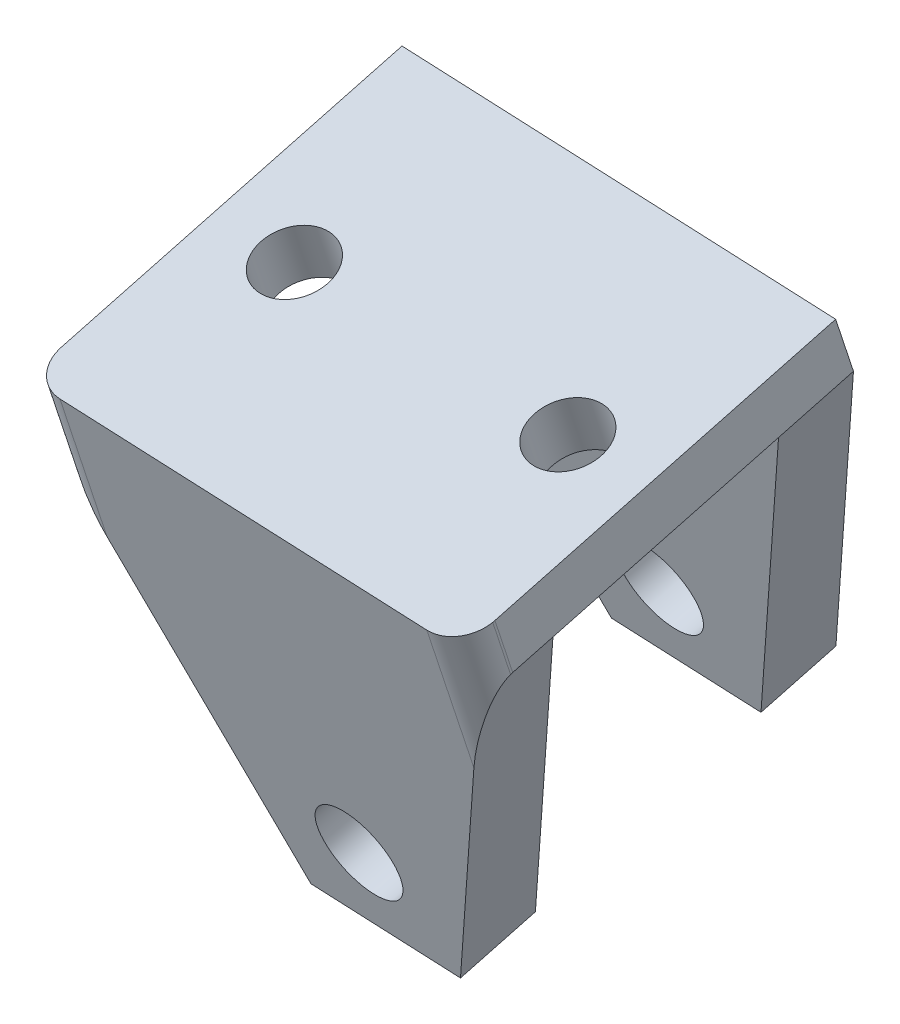
ISO-10303-21;
HEADER;
FILE_DESCRIPTION(('STEP AP214'),'2;1');
FILE_NAME('part.step','',(''),(''),'','','');
FILE_SCHEMA(('AUTOMOTIVE_DESIGN { 1 0 10303 214 1 1 1 1 }'));
ENDSEC;
DATA;
#1=APPLICATION_CONTEXT('core data for automotive mechanical design processes');
#2=APPLICATION_PROTOCOL_DEFINITION('international standard','automotive_design',2000,#1);
#3=PRODUCT_CONTEXT('',#1,'mechanical');
#4=PRODUCT('Part','Part','',(#3));
#5=PRODUCT_RELATED_PRODUCT_CATEGORY('part','',(#4));
#6=PRODUCT_DEFINITION_FORMATION('','',#4);
#7=PRODUCT_DEFINITION_CONTEXT('part definition',#1,'design');
#8=PRODUCT_DEFINITION('design','',#6,#7);
#9=PRODUCT_DEFINITION_SHAPE('','',#8);
#10=(LENGTH_UNIT() NAMED_UNIT(*) SI_UNIT(.MILLI.,.METRE.));
#11=(NAMED_UNIT(*) PLANE_ANGLE_UNIT() SI_UNIT($,.RADIAN.));
#12=(NAMED_UNIT(*) SI_UNIT($,.STERADIAN.) SOLID_ANGLE_UNIT());
#13=UNCERTAINTY_MEASURE_WITH_UNIT(LENGTH_MEASURE(1.E-05),#10,'distance_accuracy_value','');
#14=(GEOMETRIC_REPRESENTATION_CONTEXT(3) GLOBAL_UNCERTAINTY_ASSIGNED_CONTEXT((#13)) GLOBAL_UNIT_ASSIGNED_CONTEXT((#10,
#11,#12)) REPRESENTATION_CONTEXT('',''));
#15=CARTESIAN_POINT('',(0.,0.,0.));
#16=DIRECTION('',(0.,0.,1.));
#17=DIRECTION('',(1.,0.,0.));
#18=AXIS2_PLACEMENT_3D('',#15,#16,#17);
#19=CARTESIAN_POINT('',(-22.088554493688,-35.4296338674307,105.821123722836));
#20=DIRECTION('',(0.0133158588705676,-0.952264600171076,-0.304983309647527));
#21=DIRECTION('',(0.,0.305010351858926,-0.952349035416582));
#22=AXIS2_PLACEMENT_3D('',#19,#20,#21);
#23=PLANE('',#22);
#24=DIRECTION('',(-0.999048221581858,0.,-0.043619387365329));
#25=VECTOR('',#24,1.);
#26=CARTESIAN_POINT('',(-21.9355729917228,-34.3053102310021,102.317271268577));
#27=LINE('',#26,#25);
#28=CARTESIAN_POINT('',(16.1065418441597,-34.3053102311924,103.978225872484));
#29=VERTEX_POINT('',#28);
#30=CARTESIAN_POINT('',(-25.1075510952435,-34.3053102311924,102.178779713631));
#31=VERTEX_POINT('',#30);
#32=EDGE_CURVE('E170',#29,#31,#27,.T.);
#33=ORIENTED_EDGE('',*,*,#32,.T.);
#34=DIRECTION('',(-0.0415371984691523,-0.305273862721688,0.951358255276273));
#35=VECTOR('',#34,1.);
#36=CARTESIAN_POINT('',(-20.5914591715019,-1.11470333479966,-1.25673090294671));
#37=LINE('',#36,#35);
#38=CARTESIAN_POINT('',(-24.2497996394191,-28.0013439112412,82.5330414706006));
#39=VERTEX_POINT('',#38);
#40=EDGE_CURVE('E255',#39,#31,#37,.T.);
#41=ORIENTED_EDGE('',*,*,#40,.F.);
#42=DIRECTION('',(-0.999048221581858,0.,-0.0436193873653293));
#43=VECTOR('',#42,1.);
#44=CARTESIAN_POINT('',(-21.0778215358984,-28.001343911051,82.6715330255465));
#45=LINE('',#44,#43);
#46=CARTESIAN_POINT('',(16.9642932999841,-28.0013439112412,84.3324876294537));
#47=VERTEX_POINT('',#46);
#48=EDGE_CURVE('E180',#47,#39,#45,.T.);
#49=ORIENTED_EDGE('',*,*,#48,.F.);
#50=DIRECTION('',(-0.0415371984691524,-0.305273862721688,0.951358255276273));
#51=VECTOR('',#50,1.);
#52=CARTESIAN_POINT('',(20.6226337678996,-1.11470333479966,0.542715255906317));
#53=LINE('',#52,#51);
#54=EDGE_CURVE('E250',#47,#29,#53,.T.);
#55=ORIENTED_EDGE('',*,*,#54,.T.);
#56=EDGE_LOOP('',(#33,#41,#49,#55));
#57=FACE_BOUND('',#56,.T.);
#58=CARTESIAN_POINT('',(-17.0659279188797,-31.1533270711028,92.6882903239228));
#59=DIRECTION('',(0.0133158588705676,-0.952264600171076,-0.304983309647527));
#60=DIRECTION('',(0.,0.305010351858926,-0.952349035416582));
#61=AXIS2_PLACEMENT_3D('',#58,#59,#60);
#62=CIRCLE('',#61,3.175);
#63=CARTESIAN_POINT('',(-17.0659279188797,-32.1217349382549,95.7119985113705));
#64=VERTEX_POINT('',#63);
#65=EDGE_CURVE('E189',#64,#64,#62,.T.);
#66=ORIENTED_EDGE('',*,*,#65,.F.);
#67=EDGE_LOOP('',(#66));
#68=FACE_BOUND('',#67,.T.);
#69=CARTESIAN_POINT('',(8.92267012361577,-31.1533270712165,93.8229770192887));
#70=DIRECTION('',(0.0133158588705676,-0.952264600171076,-0.304983309647527));
#71=DIRECTION('',(0.,0.305010351858926,-0.952349035416582));
#72=AXIS2_PLACEMENT_3D('',#69,#70,#71);
#73=CIRCLE('',#72,3.175);
#74=CARTESIAN_POINT('',(8.92267012361577,-32.1217349383686,96.8466852067364));
#75=VERTEX_POINT('',#74);
#76=EDGE_CURVE('E168',#75,#75,#73,.T.);
#77=ORIENTED_EDGE('',*,*,#76,.F.);
#78=EDGE_LOOP('',(#77));
#79=FACE_BOUND('',#78,.T.);
#80=ADVANCED_FACE('F44',(#57,#68,#79),#23,.T.);
#81=CARTESIAN_POINT('',(-22.1561990567505,-30.5921296985616,107.370438935845));
#82=DIRECTION('',(0.0133158588705676,-0.952264600171076,-0.304983309647527));
#83=DIRECTION('',(0.,0.305010351858926,-0.952349035416582));
#84=AXIS2_PLACEMENT_3D('',#81,#82,#83);
#85=PLANE('',#84);
#86=CARTESIAN_POINT('',(-22.1561990567505,-30.5921296985616,107.370438935845));
#87=DIRECTION('',(0.0133158588705676,-0.952264600171076,-0.304983309647527));
#88=DIRECTION('',(0.,0.305010351858926,-0.952349035416582));
#89=AXIS2_PLACEMENT_3D('',#86,#87,#88);
#90=CIRCLE('',#89,3.175);
#91=CARTESIAN_POINT('',(-22.288079661886,-31.5613742128956,110.391001396294));
#92=VERTEX_POINT('',#91);
#93=CARTESIAN_POINT('',(-25.3302860569174,-30.6516996309224,107.417853475026));
#94=VERTEX_POINT('',#93);
#95=EDGE_CURVE('E193',#92,#94,#90,.T.);
#96=ORIENTED_EDGE('',*,*,#95,.F.);
#97=DIRECTION('',(0.999048221581858,0.,0.0436193873653294));
#98=VECTOR('',#97,1.);
#99=CARTESIAN_POINT('',(-4.8530112957095,-31.5613742128956,111.152232920835));
#100=LINE('',#99,#98);
#101=CARTESIAN_POINT('',(12.5820570704684,-31.561374212703,111.913464445418));
#102=VERTEX_POINT('',#101);
#103=EDGE_CURVE('E262',#92,#102,#100,.T.);
#104=ORIENTED_EDGE('',*,*,#103,.T.);
#105=CARTESIAN_POINT('',(12.713937675608,-30.5921296985616,108.892901984916));
#106=DIRECTION('',(0.0133158588705676,-0.952264600171076,-0.304983309647527));
#107=DIRECTION('',(0.,0.305010351858926,-0.952349035416582));
#108=AXIS2_PLACEMENT_3D('',#105,#106,#107);
#109=CIRCLE('',#108,3.175);
#110=CARTESIAN_POINT('',(15.8718138670775,-30.6516996309374,109.216776007565));
#111=VERTEX_POINT('',#110);
#112=EDGE_CURVE('E264',#111,#102,#109,.T.);
#113=ORIENTED_EDGE('',*,*,#112,.F.);
#114=DIRECTION('',(0.0722329192291287,0.305129551364994,-0.949567460617431));
#115=VECTOR('',#114,1.);
#116=CARTESIAN_POINT('',(23.955758751473,3.49686451625618,2.94596350866755));
#117=LINE('',#116,#115);
#118=CARTESIAN_POINT('',(15.8859157791305,-30.5921296987439,109.031393539727));
#119=VERTEX_POINT('',#118);
#120=EDGE_CURVE('E281',#111,#119,#117,.T.);
#121=ORIENTED_EDGE('',*,*,#120,.T.);
#122=DIRECTION('',(-0.0415371984691524,-0.305273862721688,0.951358255276273));
#123=VECTOR('',#122,1.);
#124=CARTESIAN_POINT('',(20.5549892048371,3.72280083406941,2.09203046891575));
#125=LINE('',#124,#123);
#126=CARTESIAN_POINT('',(17.181510844021,-21.0702715918227,79.3573879277653));
#127=VERTEX_POINT('',#126);
#128=EDGE_CURVE('E278',#127,#119,#125,.T.);
#129=ORIENTED_EDGE('',*,*,#128,.F.);
#130=DIRECTION('',(-0.999048221581858,0.,-0.043619387365329));
#131=VECTOR('',#130,1.);
#132=CARTESIAN_POINT('',(-3.42553562567795,-21.0702715918227,78.4576648483389));
#133=LINE('',#132,#131);
#134=CARTESIAN_POINT('',(-24.0325820953805,-21.0702715918227,77.5579417689123));
#135=VERTEX_POINT('',#134);
#136=EDGE_CURVE('E275',#127,#135,#133,.T.);
#137=ORIENTED_EDGE('',*,*,#136,.T.);
#138=DIRECTION('',(-0.0415371984691523,-0.305273862721688,0.951358255276273));
#139=VECTOR('',#138,1.);
#140=CARTESIAN_POINT('',(-20.6591037345644,3.72280083406941,0.292584310062723));
#141=LINE('',#140,#139);
#142=CARTESIAN_POINT('',(-25.3281771602701,-30.5921296987631,107.231947380934));
#143=VERTEX_POINT('',#142);
#144=EDGE_CURVE('E272',#135,#143,#141,.T.);
#145=ORIENTED_EDGE('',*,*,#144,.T.);
#146=DIRECTION('',(-0.0108022061553594,-0.305129551364994,0.952249583473773));
#147=VECTOR('',#146,1.);
#148=CARTESIAN_POINT('',(-24.1213574946816,3.49686451625623,0.846871281038443));
#149=LINE('',#148,#147);
#150=EDGE_CURVE('E269',#143,#94,#149,.T.);
#151=ORIENTED_EDGE('',*,*,#150,.T.);
#152=EDGE_LOOP('',(#96,#104,#113,#121,#129,#137,#145,#151));
#153=FACE_BOUND('',#152,.T.);
#154=CARTESIAN_POINT('',(-17.1335724819421,-26.3158229022338,94.2376055369323));
#155=DIRECTION('',(0.0133158588705676,-0.952264600171076,-0.304983309647527));
#156=DIRECTION('',(0.,0.305010351858926,-0.952349035416582));
#157=AXIS2_PLACEMENT_3D('',#154,#155,#156);
#158=CIRCLE('',#157,3.175);
#159=CARTESIAN_POINT('',(-17.1335724819421,-27.2842307693859,97.2613137243799));
#160=VERTEX_POINT('',#159);
#161=EDGE_CURVE('E187',#160,#160,#158,.T.);
#162=ORIENTED_EDGE('',*,*,#161,.T.);
#163=EDGE_LOOP('',(#162));
#164=FACE_BOUND('',#163,.T.);
#165=CARTESIAN_POINT('',(8.85502556055329,-26.3158229023475,95.3722922322982));
#166=DIRECTION('',(0.0133158588705676,-0.952264600171076,-0.304983309647527));
#167=DIRECTION('',(0.,0.305010351858926,-0.952349035416582));
#168=AXIS2_PLACEMENT_3D('',#165,#166,#167);
#169=CIRCLE('',#168,3.175);
#170=CARTESIAN_POINT('',(8.85502556055329,-27.2842307694996,98.3960004197458));
#171=VERTEX_POINT('',#170);
#172=EDGE_CURVE('E164',#171,#171,#169,.T.);
#173=ORIENTED_EDGE('',*,*,#172,.T.);
#174=EDGE_LOOP('',(#173));
#175=FACE_BOUND('',#174,.T.);
#176=ADVANCED_FACE('F314',(#153,#164,#175),#85,.F.);
#177=CARTESIAN_POINT('',(-22.088554493688,-35.4296338674307,105.821123722836));
#178=DIRECTION('',(-0.0133158588705677,0.952264600171076,0.304983309647527));
#179=DIRECTION('',(0.,-0.305010351858926,0.952349035416582));
#180=AXIS2_PLACEMENT_3D('',#177,#178,#179);
#181=CYLINDRICAL_SURFACE('',#180,3.175);
#182=DIRECTION('',(-0.0133158588705677,0.952264600171076,0.304983309647527));
#183=VECTOR('',#182,1.);
#184=CARTESIAN_POINT('',(-25.2626414938549,-35.4892037997915,105.868538262017));
#185=LINE('',#184,#183);
#186=CARTESIAN_POINT('',(-25.2624311948768,-35.5042430303971,105.863721623528));
#187=VERTEX_POINT('',#186);
#188=EDGE_CURVE('E299',#187,#94,#185,.T.);
#189=ORIENTED_EDGE('',*,*,#188,.F.);
#190=CARTESIAN_POINT('',(-21.9773124530868,-43.3849492808049,103.273262105776));
#191=DIRECTION('',(0.92914688746844,0.338302388046602,0.149122619845803));
#192=DIRECTION('',(-0.367370007827318,0.89014569761413,0.269592125938445));
#193=AXIS2_PLACEMENT_3D('',#190,#191,#192);
#194=ELLIPSE('',#193,8.93709359546902,3.175);
#195=CARTESIAN_POINT('',(-22.1091930582248,-44.3541937949529,106.293824566284));
#196=VERTEX_POINT('',#195);
#197=EDGE_CURVE('E216',#187,#196,#194,.T.);
#198=ORIENTED_EDGE('',*,*,#197,.T.);
#199=DIRECTION('',(-0.0133158588705677,0.952264600171076,0.304983309647527));
#200=VECTOR('',#199,1.);
#201=CARTESIAN_POINT('',(-22.2204350988235,-36.3988783817647,108.841686183284));
#202=LINE('',#201,#200);
#203=EDGE_CURVE('E159',#196,#92,#202,.T.);
#204=ORIENTED_EDGE('',*,*,#203,.T.);
#205=ORIENTED_EDGE('',*,*,#95,.T.);
#206=EDGE_LOOP('',(#189,#198,#204,#205));
#207=FACE_BOUND('',#206,.T.);
#208=ADVANCED_FACE('F46',(#207),#181,.T.);
#209=CARTESIAN_POINT('',(-24.0537129316191,-1.34063965261283,-0.702443931970994));
#210=DIRECTION('',(-0.999852989316288,-0.00938552847833725,-0.0143496205687147));
#211=DIRECTION('',(-0.0143502526262,0.,0.999897029823353));
#212=AXIS2_PLACEMENT_3D('',#209,#210,#211);
#213=PLANE('',#212);
#214=DIRECTION('',(0.00969334574264822,0.380919255247329,-0.924557494172284));
#215=VECTOR('',#214,1.);
#216=CARTESIAN_POINT('',(-24.1811206621867,6.98799997205818,2.72763393323471));
#217=LINE('',#216,#215);
#218=CARTESIAN_POINT('',(-25.2605325972102,-35.4296338676321,105.682632167925));
#219=VERTEX_POINT('',#218);
#220=EDGE_CURVE('E218',#187,#219,#217,.T.);
#221=ORIENTED_EDGE('',*,*,#220,.F.);
#222=ORIENTED_EDGE('',*,*,#188,.T.);
#223=ORIENTED_EDGE('',*,*,#150,.F.);
#224=DIRECTION('',(-0.0133158588705677,0.952264600171076,0.304983309647527));
#225=VECTOR('',#224,1.);
#226=CARTESIAN_POINT('',(-25.2605325972076,-35.4296338676322,105.682632167925));
#227=LINE('',#226,#225);
#228=EDGE_CURVE('E297',#219,#143,#227,.T.);
#229=ORIENTED_EDGE('',*,*,#228,.F.);
#230=EDGE_LOOP('',(#221,#222,#223,#229));
#231=FACE_BOUND('',#230,.T.);
#232=ADVANCED_FACE('F331',(#231),#213,.T.);
#233=CARTESIAN_POINT('',(-20.5914591715019,-1.11470333479966,-1.25673090294671));
#234=DIRECTION('',(-0.999048221581858,0.,-0.043619387365329));
#235=DIRECTION('',(-0.043619387365329,0.,0.999048221581858));
#236=AXIS2_PLACEMENT_3D('',#233,#234,#235);
#237=PLANE('',#236);
#238=DIRECTION('',(-0.0415371984691522,-0.30527386272169,0.951358255276272));
#239=VECTOR('',#238,1.);
#240=CARTESIAN_POINT('',(-17.1039603910172,24.5163517963293,-81.1335853216006));
#241=LINE('',#240,#239);
#242=EDGE_CURVE('E151',#31,#219,#241,.T.);
#243=ORIENTED_EDGE('',*,*,#242,.T.);
#244=ORIENTED_EDGE('',*,*,#228,.T.);
#245=ORIENTED_EDGE('',*,*,#144,.F.);
#246=DIRECTION('',(-0.0133158588705677,0.952264600171076,0.304983309647527));
#247=VECTOR('',#246,1.);
#248=CARTESIAN_POINT('',(-23.964937532318,-25.9077757606918,76.0086265559029));
#249=LINE('',#248,#247);
#250=CARTESIAN_POINT('',(-23.9649375323171,-25.9077757606917,76.0086265559029));
#251=VERTEX_POINT('',#250);
#252=EDGE_CURVE('E295',#251,#135,#249,.T.);
#253=ORIENTED_EDGE('',*,*,#252,.F.);
#254=EDGE_CURVE('E225',#251,#39,#241,.T.);
#255=ORIENTED_EDGE('',*,*,#254,.T.);
#256=ORIENTED_EDGE('',*,*,#40,.T.);
#257=EDGE_LOOP('',(#243,#244,#245,#253,#255,#256));
#258=FACE_BOUND('',#257,.T.);
#259=ADVANCED_FACE('F333',(#258),#237,.T.);
#260=CARTESIAN_POINT('',(-3.35789106261546,-25.9077757606918,76.9083496353294));
#261=DIRECTION('',(0.0415371984691523,0.305273862721688,-0.951358255276273));
#262=DIRECTION('',(0.,0.952180026486865,0.305537554417576));
#263=AXIS2_PLACEMENT_3D('',#260,#261,#262);
#264=PLANE('',#263);
#265=CARTESIAN_POINT('',(-2.98584596577187,-52.5140486894716,68.3871159637776));
#266=DIRECTION('',(0.0415371984691523,0.305273862721688,-0.951358255276273));
#267=DIRECTION('',(0.,0.952180026486865,0.305537554417576));
#268=AXIS2_PLACEMENT_3D('',#265,#266,#267);
#269=CIRCLE('',#268,3.96875);
#270=CARTESIAN_POINT('',(-2.98584596577187,-48.7350842093519,69.5997181328723));
#271=VERTEX_POINT('',#270);
#272=EDGE_CURVE('E184',#271,#271,#269,.T.);
#273=ORIENTED_EDGE('',*,*,#272,.F.);
#274=EDGE_LOOP('',(#273));
#275=FACE_BOUND('',#274,.T.);
#276=DIRECTION('',(0.342475552060416,0.89014569761413,0.300584652402559));
#277=VECTOR('',#276,1.);
#278=CARTESIAN_POINT('',(14.7395450544246,-32.4306321942962,75.6054326986081));
#279=LINE('',#278,#277);
#280=CARTESIAN_POINT('',(4.22085183070946,-59.7703049425588,66.3733642272657));
#281=VERTEX_POINT('',#280);
#282=CARTESIAN_POINT('',(17.2491554070861,-25.9077757606917,77.8080727147561));
#283=VERTEX_POINT('',#282);
#284=EDGE_CURVE('E204',#281,#283,#279,.T.);
#285=ORIENTED_EDGE('',*,*,#284,.F.);
#286=DIRECTION('',(-0.999048221581858,0.,-0.043619387365329));
#287=VECTOR('',#286,1.);
#288=CARTESIAN_POINT('',(-20.3194474873586,-59.7703049425823,65.3019116197744));
#289=LINE('',#288,#287);
#290=CARTESIAN_POINT('',(-9.98961007306117,-59.7703049425823,65.7529220613742));
#291=VERTEX_POINT('',#290);
#292=EDGE_CURVE('E176',#281,#291,#289,.T.);
#293=ORIENTED_EDGE('',*,*,#292,.T.);
#294=DIRECTION('',(0.367370007827318,-0.89014569761413,-0.269592125938445));
#295=VECTOR('',#294,1.);
#296=CARTESIAN_POINT('',(-21.2729042781064,-32.4306321942962,74.033095204305));
#297=LINE('',#296,#295);
#298=EDGE_CURVE('E220',#251,#291,#297,.T.);
#299=ORIENTED_EDGE('',*,*,#298,.F.);
#300=ORIENTED_EDGE('',*,*,#252,.T.);
#301=ORIENTED_EDGE('',*,*,#136,.F.);
#302=DIRECTION('',(-0.0133158588705677,0.952264600171076,0.304983309647527));
#303=VECTOR('',#302,1.);
#304=CARTESIAN_POINT('',(17.2491554070835,-25.9077757606918,77.8080727147559));
#305=LINE('',#304,#303);
#306=EDGE_CURVE('E293',#283,#127,#305,.T.);
#307=ORIENTED_EDGE('',*,*,#306,.F.);
#308=EDGE_LOOP('',(#285,#293,#299,#300,#301,#307));
#309=FACE_BOUND('',#308,.T.);
#310=ADVANCED_FACE('F309',(#275,#309),#264,.T.);
#311=CARTESIAN_POINT('',(20.6226337678996,-1.11470333479966,0.542715255906317));
#312=DIRECTION('',(-0.999048221581858,0.,-0.0436193873653291));
#313=DIRECTION('',(-0.0436193873653291,0.,0.999048221581858));
#314=AXIS2_PLACEMENT_3D('',#311,#312,#313);
#315=PLANE('',#314);
#316=DIRECTION('',(-0.0133158588705677,0.952264600171076,0.304983309647527));
#317=VECTOR('',#316,1.);
#318=CARTESIAN_POINT('',(15.953560342193,-35.4296338676129,107.482078326718));
#319=LINE('',#318,#317);
#320=CARTESIAN_POINT('',(15.9535603421881,-35.4296338676679,107.48207832689));
#321=VERTEX_POINT('',#320);
#322=EDGE_CURVE('E291',#321,#119,#319,.T.);
#323=ORIENTED_EDGE('',*,*,#322,.F.);
#324=DIRECTION('',(-0.0415371984691522,-0.30527386272169,0.951358255276272));
#325=VECTOR('',#324,1.);
#326=CARTESIAN_POINT('',(24.110132548386,24.5163517963293,-79.3341391627475));
#327=LINE('',#326,#325);
#328=EDGE_CURVE('E234',#29,#321,#327,.T.);
#329=ORIENTED_EDGE('',*,*,#328,.F.);
#330=ORIENTED_EDGE('',*,*,#54,.F.);
#331=EDGE_CURVE('E232',#283,#47,#327,.T.);
#332=ORIENTED_EDGE('',*,*,#331,.F.);
#333=ORIENTED_EDGE('',*,*,#306,.T.);
#334=ORIENTED_EDGE('',*,*,#128,.T.);
#335=EDGE_LOOP('',(#323,#329,#330,#332,#333,#334));
#336=FACE_BOUND('',#335,.T.);
#337=ADVANCED_FACE('F252',(#336),#315,.F.);
#338=CARTESIAN_POINT('',(24.0234033145355,-1.34063965261289,1.39664829565811));
#339=DIRECTION('',(0.997298898666883,-0.0093855284783371,0.0728479139921318));
#340=DIRECTION('',(0.0728511227229204,0.,-0.997342826673963));
#341=AXIS2_PLACEMENT_3D('',#338,#339,#340);
#342=PLANE('',#341);
#343=DIRECTION('',(-0.07092403548189,-0.38091925524733,0.92188410452333));
#344=VECTOR('',#343,1.);
#345=CARTESIAN_POINT('',(23.8513752361983,6.98799997207333,4.82477799441357));
#346=LINE('',#345,#344);
#347=CARTESIAN_POINT('',(15.9396687291179,-35.5042430304002,107.662644156071));
#348=VERTEX_POINT('',#347);
#349=EDGE_CURVE('E206',#321,#348,#346,.T.);
#350=ORIENTED_EDGE('',*,*,#349,.F.);
#351=ORIENTED_EDGE('',*,*,#322,.T.);
#352=ORIENTED_EDGE('',*,*,#120,.F.);
#353=DIRECTION('',(-0.0133158588705677,0.952264600171076,0.304983309647527));
#354=VECTOR('',#353,1.);
#355=CARTESIAN_POINT('',(15.93945843014,-35.4892037998065,107.667460794556));
#356=LINE('',#355,#354);
#357=EDGE_CURVE('E289',#348,#111,#356,.T.);
#358=ORIENTED_EDGE('',*,*,#357,.F.);
#359=EDGE_LOOP('',(#350,#351,#352,#358));
#360=FACE_BOUND('',#359,.T.);
#361=ADVANCED_FACE('F320',(#360),#342,.T.);
#362=CARTESIAN_POINT('',(12.7815822386705,-35.4296338674307,107.343586771907));
#363=DIRECTION('',(-0.0133158588705677,0.952264600171076,0.304983309647527));
#364=DIRECTION('',(0.,-0.305010351858926,0.952349035416582));
#365=AXIS2_PLACEMENT_3D('',#362,#363,#364);
#366=CYLINDRICAL_SURFACE('',#365,3.175);
#367=DIRECTION('',(-0.0133158588705677,0.952264600171076,0.304983309647527));
#368=VECTOR('',#367,1.);
#369=CARTESIAN_POINT('',(12.6497016335309,-36.3988783815721,110.364149232409));
#370=LINE('',#369,#368);
#371=CARTESIAN_POINT('',(12.7609436741312,-44.3541937949449,107.81628761537));
#372=VERTEX_POINT('',#371);
#373=EDGE_CURVE('E287',#372,#102,#370,.T.);
#374=ORIENTED_EDGE('',*,*,#373,.F.);
#375=CARTESIAN_POINT('',(12.8928242792716,-43.3849492807975,104.795725154849));
#376=DIRECTION('',(-0.938608095737645,0.338302388046602,0.0675746761569663));
#377=DIRECTION('',(0.342475552060416,0.89014569761413,0.300584652402559));
#378=AXIS2_PLACEMENT_3D('',#375,#376,#377);
#379=ELLIPSE('',#378,8.93709359546904,3.175);
#380=EDGE_CURVE('E208',#372,#348,#379,.T.);
#381=ORIENTED_EDGE('',*,*,#380,.T.);
#382=ORIENTED_EDGE('',*,*,#357,.T.);
#383=ORIENTED_EDGE('',*,*,#112,.T.);
#384=EDGE_LOOP('',(#374,#381,#382,#383));
#385=FACE_BOUND('',#384,.T.);
#386=ADVANCED_FACE('F324',(#385),#366,.T.);
#387=CARTESIAN_POINT('',(-4.78536673264701,-36.3988783817647,109.602917707826));
#388=DIRECTION('',(-0.0415371984691527,-0.305273862721688,0.951358255276273));
#389=DIRECTION('',(0.,-0.952180026486865,-0.305537554417576));
#390=AXIS2_PLACEMENT_3D('',#387,#388,#389);
#391=PLANE('',#390);
#392=CARTESIAN_POINT('',(-4.41332163580337,-63.0051513105445,101.081684036274));
#393=DIRECTION('',(-0.0415371984691522,-0.30527386272169,0.951358255276272));
#394=DIRECTION('',(0.,-0.952180026486864,-0.305537554417578));
#395=AXIS2_PLACEMENT_3D('',#392,#393,#394);
#396=CIRCLE('',#395,3.96875);
#397=CARTESIAN_POINT('',(-4.41332163580337,-66.7841157906643,99.8690818671793));
#398=VERTEX_POINT('',#397);
#399=EDGE_CURVE('E160',#398,#398,#396,.T.);
#400=ORIENTED_EDGE('',*,*,#399,.F.);
#401=EDGE_LOOP('',(#400));
#402=FACE_BOUND('',#401,.T.);
#403=DIRECTION('',(-0.342475552060416,-0.89014569761413,-0.300584652402561));
#404=VECTOR('',#403,1.);
#405=CARTESIAN_POINT('',(2.7933761606776,-70.2614075636343,99.0679322997706));
#406=LINE('',#405,#404);
#407=CARTESIAN_POINT('',(2.79337616067745,-70.2614075636552,99.0679322997547));
#408=VERTEX_POINT('',#407);
#409=EDGE_CURVE('E60',#372,#408,#406,.T.);
#410=ORIENTED_EDGE('',*,*,#409,.F.);
#411=ORIENTED_EDGE('',*,*,#373,.T.);
#412=ORIENTED_EDGE('',*,*,#103,.F.);
#413=ORIENTED_EDGE('',*,*,#203,.F.);
#414=DIRECTION('',(-0.367370007827318,0.890145697614129,0.269592125938446));
#415=VECTOR('',#414,1.);
#416=CARTESIAN_POINT('',(-11.4170857431028,-70.2614075636343,98.4474901338862));
#417=LINE('',#416,#415);
#418=CARTESIAN_POINT('',(-11.4170857431028,-70.2614075636343,98.4474901338862));
#419=VERTEX_POINT('',#418);
#420=EDGE_CURVE('E145',#419,#196,#417,.T.);
#421=ORIENTED_EDGE('',*,*,#420,.F.);
#422=DIRECTION('',(0.999048221581858,0.,0.0436193873653294));
#423=VECTOR('',#422,1.);
#424=CARTESIAN_POINT('',(-21.7469231573901,-70.2614075636552,97.996479692271));
#425=LINE('',#424,#423);
#426=EDGE_CURVE('E157',#419,#408,#425,.T.);
#427=ORIENTED_EDGE('',*,*,#426,.T.);
#428=EDGE_LOOP('',(#410,#411,#412,#413,#421,#427));
#429=FACE_BOUND('',#428,.T.);
#430=ADVANCED_FACE('F156',(#402,#429),#391,.T.);
#431=CARTESIAN_POINT('',(-17.0659279188797,-31.1533270711028,92.6882903239228));
#432=DIRECTION('',(-0.0133158588705677,0.952264600171076,0.304983309647527));
#433=DIRECTION('',(0.,-0.305010351858926,0.952349035416582));
#434=AXIS2_PLACEMENT_3D('',#431,#432,#433);
#435=CYLINDRICAL_SURFACE('',#434,3.175);
#436=CARTESIAN_POINT('',(-17.0659279188797,-32.1217349382549,95.7119985113705));
#437=CARTESIAN_POINT('',(-17.0666325497449,-32.0713442698292,95.728137211506));
#438=CARTESIAN_POINT('',(-17.0673371806101,-32.0209536014035,95.7442759116415));
#439=CARTESIAN_POINT('',(-17.0687464423406,-31.9201722645521,95.7765533119126));
#440=CARTESIAN_POINT('',(-17.0694510732058,-31.8697815961263,95.7926920120481));
#441=CARTESIAN_POINT('',(-17.0708603349363,-31.7690002592749,95.8249694123191));
#442=CARTESIAN_POINT('',(-17.0715649658015,-31.7186095908492,95.8411081124546));
#443=CARTESIAN_POINT('',(-17.072974227532,-31.6178282539977,95.8733855127256));
#444=CARTESIAN_POINT('',(-17.0736788583972,-31.567437585572,95.8895242128611));
#445=CARTESIAN_POINT('',(-17.0750881201277,-31.4666562487206,95.9218016131322));
#446=CARTESIAN_POINT('',(-17.0757927509929,-31.4162655802949,95.9379403132677));
#447=CARTESIAN_POINT('',(-17.0772020127234,-31.3154842434434,95.9702177135387));
#448=CARTESIAN_POINT('',(-17.0779066435886,-31.2650935750177,95.9863564136742));
#449=CARTESIAN_POINT('',(-17.0793159053191,-31.1643122381663,96.0186338139453));
#450=CARTESIAN_POINT('',(-17.0800205361843,-31.1139215697405,96.0347725140808));
#451=CARTESIAN_POINT('',(-17.0814297979148,-31.0131402328891,96.0670499143518));
#452=CARTESIAN_POINT('',(-17.08213442878,-30.9627495644634,96.0831886144873));
#453=CARTESIAN_POINT('',(-17.0835436905105,-30.8619682276119,96.1154660147584));
#454=CARTESIAN_POINT('',(-17.0842483213757,-30.8115775591862,96.1316047148939));
#455=CARTESIAN_POINT('',(-17.0856575831062,-30.7107962223348,96.1638821151649));
#456=CARTESIAN_POINT('',(-17.0863622139714,-30.6604055539091,96.1800208153004));
#457=CARTESIAN_POINT('',(-17.0877714757019,-30.5596242170576,96.2122982155715));
#458=CARTESIAN_POINT('',(-17.0884761065672,-30.5092335486319,96.228436915707));
#459=CARTESIAN_POINT('',(-17.0898853682976,-30.4084522117805,96.260714315978));
#460=CARTESIAN_POINT('',(-17.0905899991629,-30.3580615433548,96.2768530161135));
#461=CARTESIAN_POINT('',(-17.0919992608933,-30.2572802065033,96.3091304163845));
#462=CARTESIAN_POINT('',(-17.0927038917586,-30.2068895380776,96.3252691165201));
#463=CARTESIAN_POINT('',(-17.094113153489,-30.1061082012262,96.3575465167911));
#464=CARTESIAN_POINT('',(-17.0948177843543,-30.0557175328004,96.3736852169266));
#465=CARTESIAN_POINT('',(-17.0962270460847,-29.954936195949,96.4059626171976));
#466=CARTESIAN_POINT('',(-17.09693167695,-29.9045455275233,96.4221013173331));
#467=CARTESIAN_POINT('',(-17.0983409386804,-29.8037641906718,96.4543787176042));
#468=CARTESIAN_POINT('',(-17.0990455695457,-29.7533735222461,96.4705174177397));
#469=CARTESIAN_POINT('',(-17.1004548312761,-29.6525921853947,96.5027948180107));
#470=CARTESIAN_POINT('',(-17.1011594621414,-29.602201516969,96.5189335181462));
#471=CARTESIAN_POINT('',(-17.1025687238718,-29.5014201801175,96.5512109184173));
#472=CARTESIAN_POINT('',(-17.1032733547371,-29.4510295116918,96.5673496185528));
#473=CARTESIAN_POINT('',(-17.1046826164675,-29.3502481748404,96.5996270188238));
#474=CARTESIAN_POINT('',(-17.1053872473328,-29.2998575064146,96.6157657189593));
#475=CARTESIAN_POINT('',(-17.1067965090632,-29.1990761695632,96.6480431192304));
#476=CARTESIAN_POINT('',(-17.1075011399285,-29.1486855011375,96.6641818193659));
#477=CARTESIAN_POINT('',(-17.1089104016589,-29.047904164286,96.6964592196369));
#478=CARTESIAN_POINT('',(-17.1096150325242,-28.9975134958603,96.7125979197724));
#479=CARTESIAN_POINT('',(-17.1110242942546,-28.8967321590089,96.7448753200435));
#480=CARTESIAN_POINT('',(-17.1117289251199,-28.8463414905832,96.761014020179));
#481=CARTESIAN_POINT('',(-17.1131381868503,-28.7455601537317,96.79329142045));
#482=CARTESIAN_POINT('',(-17.1138428177156,-28.695169485306,96.8094301205855));
#483=CARTESIAN_POINT('',(-17.115252079446,-28.5943881484546,96.8417075208565));
#484=CARTESIAN_POINT('',(-17.1159567103113,-28.5439974800289,96.8578462209921));
#485=CARTESIAN_POINT('',(-17.1173659720417,-28.4432161431774,96.8901236212631));
#486=CARTESIAN_POINT('',(-17.118070602907,-28.3928254747517,96.9062623213986));
#487=CARTESIAN_POINT('',(-17.1194798646375,-28.2920441379003,96.9385397216696));
#488=CARTESIAN_POINT('',(-17.1201844955027,-28.2416534694745,96.9546784218052));
#489=CARTESIAN_POINT('',(-17.1215937572332,-28.1408721326231,96.9869558220762));
#490=CARTESIAN_POINT('',(-17.1222983880984,-28.0904814641974,97.0030945222117));
#491=CARTESIAN_POINT('',(-17.1237076498289,-27.9897001273459,97.0353719224827));
#492=CARTESIAN_POINT('',(-17.1244122806941,-27.9393094589202,97.0515106226182));
#493=CARTESIAN_POINT('',(-17.1258215424246,-27.8385281220688,97.0837880228893));
#494=CARTESIAN_POINT('',(-17.1265261732898,-27.7881374536431,97.0999267230248));
#495=CARTESIAN_POINT('',(-17.1279354350203,-27.6873561167916,97.1322041232958));
#496=CARTESIAN_POINT('',(-17.1286400658855,-27.6369654483659,97.1483428234313));
#497=CARTESIAN_POINT('',(-17.130049327616,-27.5361841115145,97.1806202237024));
#498=CARTESIAN_POINT('',(-17.1307539584812,-27.4857934430887,97.1967589238379));
#499=CARTESIAN_POINT('',(-17.1321632202117,-27.3850121062373,97.2290363241089));
#500=CARTESIAN_POINT('',(-17.1328678510769,-27.3346214378116,97.2451750242444));
#501=CARTESIAN_POINT('',(-17.1335724819421,-27.2842307693859,97.2613137243799));
#502=B_SPLINE_CURVE_WITH_KNOTS('',3,(#436,#437,#438,#439,#440,#441,#442,#443,#444,#445,#446,
#447,#448,#449,#450,#451,#452,#453,#454,#455,#456,#457,#458,#459,#460,#461,#462,#463,#464,#465,
#466,#467,#468,#469,#470,#471,#472,#473,#474,#475,#476,#477,#478,#479,#480,#481,#482,#483,#484,
#485,#486,#487,#488,#489,#490,#491,#492,#493,#494,#495,#496,#497,#498,#499,#500,#501),
.UNSPECIFIED.,.F.,.F.,(4,2,2,2,2,2,2,2,2,2,2,2,2,2,2,2,2,2,2,2,2,2,2,2,2,2,2,2,2,2,2,2,4),(0.,
0.158749999999992,0.317499999999995,0.476249999999994,0.634999999999993,0.793749999999996,
0.952499999999994,1.11124999999999,1.27,1.42874999999999,1.5875,1.74625,1.905,2.06375,
2.22249999999999,2.38124999999999,2.54,2.69874999999999,2.8575,3.01625,3.17499999999999,3.33375,
3.49249999999999,3.65124999999999,3.80999999999999,3.96874999999999,4.1275,4.28624999999999,
4.44499999999999,4.60375,4.7625,4.92124999999999,5.07999999999999),.UNSPECIFIED.);
#503=EDGE_CURVE('BSEAM349',#64,#160,#502,.T.);
#504=ORIENTED_EDGE('',*,*,#65,.T.);
#505=ORIENTED_EDGE('',*,*,#161,.F.);
#506=ORIENTED_EDGE('',*,*,#503,.T.);
#507=ORIENTED_EDGE('',*,*,#503,.F.);
#508=EDGE_LOOP('',(#504,#506,#505,#507));
#509=FACE_BOUND('',#508,.T.);
#510=ADVANCED_FACE('F349',(#509),#435,.F.);
#511=CARTESIAN_POINT('',(8.92267012361577,-31.1533270712165,93.8229770192887));
#512=DIRECTION('',(-0.0133158588705677,0.952264600171076,0.304983309647527));
#513=DIRECTION('',(0.,-0.305010351858926,0.952349035416582));
#514=AXIS2_PLACEMENT_3D('',#511,#512,#513);
#515=CYLINDRICAL_SURFACE('',#514,3.175);
#516=CARTESIAN_POINT('',(8.92267012361577,-32.1217349383686,96.8466852067364));
#517=CARTESIAN_POINT('',(8.92196549275054,-32.0713442699429,96.8628239068719));
#518=CARTESIAN_POINT('',(8.9212608618853,-32.0209536015172,96.8789626070074));
#519=CARTESIAN_POINT('',(8.91985160015484,-31.9201722646657,96.9112400072784));
#520=CARTESIAN_POINT('',(8.9191469692896,-31.86978159624,96.9273787074139));
#521=CARTESIAN_POINT('',(8.91773770755913,-31.7690002593886,96.959656107685));
#522=CARTESIAN_POINT('',(8.9170330766939,-31.7186095909629,96.9757948078205));
#523=CARTESIAN_POINT('',(8.91562381496343,-31.6178282541114,97.0080722080915));
#524=CARTESIAN_POINT('',(8.9149191840982,-31.5674375856857,97.024210908227));
#525=CARTESIAN_POINT('',(8.91350992236773,-31.4666562488343,97.0564883084981));
#526=CARTESIAN_POINT('',(8.91280529150249,-31.4162655804086,97.0726270086336));
#527=CARTESIAN_POINT('',(8.91139602977202,-31.3154842435571,97.1049044089046));
#528=CARTESIAN_POINT('',(8.91069139890679,-31.2650935751314,97.1210431090401));
#529=CARTESIAN_POINT('',(8.90928213717632,-31.16431223828,97.1533205093111));
#530=CARTESIAN_POINT('',(8.90857750631109,-31.1139215698542,97.1694592094467));
#531=CARTESIAN_POINT('',(8.90716824458062,-31.0131402330028,97.2017366097177));
#532=CARTESIAN_POINT('',(8.90646361371538,-30.9627495645771,97.2178753098532));
#533=CARTESIAN_POINT('',(8.90505435198492,-30.8619682277256,97.2501527101242));
#534=CARTESIAN_POINT('',(8.90434972111968,-30.8115775592999,97.2662914102598));
#535=CARTESIAN_POINT('',(8.90294045938921,-30.7107962224485,97.2985688105308));
#536=CARTESIAN_POINT('',(8.90223582852398,-30.6604055540228,97.3147075106663));
#537=CARTESIAN_POINT('',(8.90082656679351,-30.5596242171713,97.3469849109373));
#538=CARTESIAN_POINT('',(8.90012193592828,-30.5092335487456,97.3631236110728));
#539=CARTESIAN_POINT('',(8.89871267419781,-30.4084522118942,97.3954010113439));
#540=CARTESIAN_POINT('',(8.89800804333257,-30.3580615434684,97.4115397114794));
#541=CARTESIAN_POINT('',(8.89659878160211,-30.257280206617,97.4438171117504));
#542=CARTESIAN_POINT('',(8.89589415073687,-30.2068895381913,97.4599558118859));
#543=CARTESIAN_POINT('',(8.8944848890064,-30.1061082013398,97.492233212157));
#544=CARTESIAN_POINT('',(8.89378025814117,-30.0557175329141,97.5083719122925));
#545=CARTESIAN_POINT('',(8.8923709964107,-29.9549361960627,97.5406493125635));
#546=CARTESIAN_POINT('',(8.89166636554546,-29.904545527637,97.556788012699));
#547=CARTESIAN_POINT('',(8.890257103815,-29.8037641907855,97.58906541297));
#548=CARTESIAN_POINT('',(8.88955247294976,-29.7533735223598,97.6052041131056));
#549=CARTESIAN_POINT('',(8.8881432112193,-29.6525921855084,97.6374815133766));
#550=CARTESIAN_POINT('',(8.88743858035406,-29.6022015170826,97.6536202135121));
#551=CARTESIAN_POINT('',(8.88602931862359,-29.5014201802312,97.6858976137831));
#552=CARTESIAN_POINT('',(8.88532468775836,-29.4510295118055,97.7020363139187));
#553=CARTESIAN_POINT('',(8.88391542602789,-29.3502481749541,97.7343137141897));
#554=CARTESIAN_POINT('',(8.88321079516266,-29.2998575065283,97.7504524143252));
#555=CARTESIAN_POINT('',(8.88180153343219,-29.1990761696769,97.7827298145962));
#556=CARTESIAN_POINT('',(8.88109690256695,-29.1486855012512,97.7988685147317));
#557=CARTESIAN_POINT('',(8.87968764083648,-29.0479041643997,97.8311459150028));
#558=CARTESIAN_POINT('',(8.87898300997125,-28.997513495974,97.8472846151383));
#559=CARTESIAN_POINT('',(8.87757374824078,-28.8967321591226,97.8795620154093));
#560=CARTESIAN_POINT('',(8.87686911737555,-28.8463414906969,97.8957007155448));
#561=CARTESIAN_POINT('',(8.87545985564508,-28.7455601538454,97.9279781158159));
#562=CARTESIAN_POINT('',(8.87475522477984,-28.6951694854197,97.9441168159514));
#563=CARTESIAN_POINT('',(8.87334596304938,-28.5943881485683,97.9763942162224));
#564=CARTESIAN_POINT('',(8.87264133218414,-28.5439974801425,97.9925329163579));
#565=CARTESIAN_POINT('',(8.87123207045367,-28.4432161432911,98.024810316629));
#566=CARTESIAN_POINT('',(8.87052743958844,-28.3928254748654,98.0409490167645));
#567=CARTESIAN_POINT('',(8.86911817785797,-28.2920441380139,98.0732264170355));
#568=CARTESIAN_POINT('',(8.86841354699274,-28.2416534695882,98.089365117171));
#569=CARTESIAN_POINT('',(8.86700428526227,-28.1408721327368,98.1216425174421));
#570=CARTESIAN_POINT('',(8.86629965439703,-28.0904814643111,98.1377812175776));
#571=CARTESIAN_POINT('',(8.86489039266657,-27.9897001274596,98.1700586178486));
#572=CARTESIAN_POINT('',(8.86418576180133,-27.9393094590339,98.1861973179841));
#573=CARTESIAN_POINT('',(8.86277650007086,-27.8385281221825,98.2184747182551));
#574=CARTESIAN_POINT('',(8.86207186920563,-27.7881374537567,98.2346134183907));
#575=CARTESIAN_POINT('',(8.86066260747516,-27.6873561169053,98.2668908186617));
#576=CARTESIAN_POINT('',(8.85995797660993,-27.6369654484796,98.2830295187972));
#577=CARTESIAN_POINT('',(8.85854871487946,-27.5361841116282,98.3153069190682));
#578=CARTESIAN_POINT('',(8.85784408401422,-27.4857934432024,98.3314456192037));
#579=CARTESIAN_POINT('',(8.85643482228376,-27.385012106351,98.3637230194748));
#580=CARTESIAN_POINT('',(8.85573019141852,-27.3346214379253,98.3798617196103));
#581=CARTESIAN_POINT('',(8.85502556055329,-27.2842307694996,98.3960004197458));
#582=B_SPLINE_CURVE_WITH_KNOTS('',3,(#516,#517,#518,#519,#520,#521,#522,#523,#524,#525,#526,
#527,#528,#529,#530,#531,#532,#533,#534,#535,#536,#537,#538,#539,#540,#541,#542,#543,#544,#545,
#546,#547,#548,#549,#550,#551,#552,#553,#554,#555,#556,#557,#558,#559,#560,#561,#562,#563,#564,
#565,#566,#567,#568,#569,#570,#571,#572,#573,#574,#575,#576,#577,#578,#579,#580,#581),
.UNSPECIFIED.,.F.,.F.,(4,2,2,2,2,2,2,2,2,2,2,2,2,2,2,2,2,2,2,2,2,2,2,2,2,2,2,2,2,2,2,2,4),(0.,
0.158749999999992,0.317499999999995,0.476249999999994,0.634999999999993,0.793749999999996,
0.952499999999994,1.11124999999999,1.27,1.42874999999999,1.5875,1.74625,1.905,2.06375,
2.22249999999999,2.38124999999999,2.54,2.69874999999999,2.8575,3.01625,3.17499999999999,3.33375,
3.49249999999999,3.65124999999999,3.80999999999999,3.96874999999999,4.1275,4.28624999999999,
4.44499999999999,4.60375,4.7625,4.92124999999999,5.07999999999999),.UNSPECIFIED.);
#583=EDGE_CURVE('BSEAM339',#75,#171,#582,.T.);
#584=ORIENTED_EDGE('',*,*,#76,.T.);
#585=ORIENTED_EDGE('',*,*,#172,.F.);
#586=ORIENTED_EDGE('',*,*,#583,.T.);
#587=ORIENTED_EDGE('',*,*,#583,.F.);
#588=EDGE_LOOP('',(#584,#586,#585,#587));
#589=FACE_BOUND('',#588,.T.);
#590=ADVANCED_FACE('F339',(#589),#515,.F.);
#591=CARTESIAN_POINT('',(-21.4620610502854,-68.1678394130856,91.4720647775108));
#592=DIRECTION('',(0.0415371984691523,0.305273862721688,-0.951358255276273));
#593=DIRECTION('',(0.,0.952180026486865,0.305537554417576));
#594=AXIS2_PLACEMENT_3D('',#591,#592,#593);
#595=PLANE('',#594);
#596=CARTESIAN_POINT('',(-4.12845952869827,-60.9115831599723,94.5572691215057));
#597=DIRECTION('',(0.0415371984691523,0.305273862721688,-0.951358255276273));
#598=DIRECTION('',(0.,0.952180026486865,0.305537554417576));
#599=AXIS2_PLACEMENT_3D('',#596,#597,#598);
#600=CIRCLE('',#599,3.96875);
#601=CARTESIAN_POINT('',(-4.12845952869827,-57.1326186798526,95.7698712906004));
#602=VERTEX_POINT('',#601);
#603=EDGE_CURVE('E201',#602,#602,#600,.T.);
#604=ORIENTED_EDGE('',*,*,#603,.F.);
#605=EDGE_LOOP('',(#604));
#606=FACE_BOUND('',#605,.T.);
#607=DIRECTION('',(0.342475552060416,0.89014569761413,0.300584652402559));
#608=VECTOR('',#607,1.);
#609=CARTESIAN_POINT('',(0.0896203056332326,-75.9357089874438,89.9204609772903));
#610=LINE('',#609,#608);
#611=CARTESIAN_POINT('',(3.0782382677877,-68.1678394130254,92.5435173848878));
#612=VERTEX_POINT('',#611);
#613=EDGE_CURVE('E211',#612,#29,#610,.T.);
#614=ORIENTED_EDGE('',*,*,#613,.F.);
#615=DIRECTION('',(-0.999048221581858,0.,-0.043619387365329));
#616=VECTOR('',#615,1.);
#617=CARTESIAN_POINT('',(-21.4620610502854,-68.1678394130856,91.4720647775108));
#618=LINE('',#617,#616);
#619=CARTESIAN_POINT('',(-11.1322236359731,-68.1678394131039,91.9230752191054));
#620=VERTEX_POINT('',#619);
#621=EDGE_CURVE('E165',#612,#620,#618,.T.);
#622=ORIENTED_EDGE('',*,*,#621,.T.);
#623=DIRECTION('',(0.367370007827318,-0.89014569761413,-0.269592125938445));
#624=VECTOR('',#623,1.);
#625=CARTESIAN_POINT('',(-12.4816778564539,-64.8980818311339,92.9133635507673));
#626=LINE('',#625,#624);
#627=EDGE_CURVE('E68',#31,#620,#626,.T.);
#628=ORIENTED_EDGE('',*,*,#627,.F.);
#629=ORIENTED_EDGE('',*,*,#32,.F.);
#630=EDGE_LOOP('',(#614,#622,#628,#629));
#631=FACE_BOUND('',#630,.T.);
#632=ADVANCED_FACE('F337',(#606,#631),#595,.T.);
#633=CARTESIAN_POINT('',(-21.6150425522492,-69.2921630495492,94.9759172317532));
#634=DIRECTION('',(0.0133158588705676,-0.952264600171076,-0.304983309647527));
#635=DIRECTION('',(0.,0.305010351858926,-0.952349035416582));
#636=AXIS2_PLACEMENT_3D('',#633,#634,#635);
#637=PLANE('',#636);
#638=DIRECTION('',(-0.0415371984691522,-0.30527386272169,0.951358255276272));
#639=VECTOR('',#638,1.);
#640=CARTESIAN_POINT('',(11.081828972009,-9.3461773855404,-90.7688476502295));
#641=LINE('',#640,#639);
#642=EDGE_CURVE('E163',#612,#408,#641,.T.);
#643=ORIENTED_EDGE('',*,*,#642,.T.);
#644=ORIENTED_EDGE('',*,*,#426,.F.);
#645=DIRECTION('',(-0.0415371984691522,-0.30527386272169,0.951358255276272));
#646=VECTOR('',#645,1.);
#647=CARTESIAN_POINT('',(-3.12863293177139,-9.3461773855404,-91.3892898161139));
#648=LINE('',#647,#646);
#649=EDGE_CURVE('E142',#620,#419,#648,.T.);
#650=ORIENTED_EDGE('',*,*,#649,.F.);
#651=ORIENTED_EDGE('',*,*,#621,.F.);
#652=EDGE_LOOP('',(#643,#644,#650,#651));
#653=FACE_BOUND('',#652,.T.);
#654=ADVANCED_FACE('F162',(#653),#637,.T.);
#655=CARTESIAN_POINT('',(-20.604309594461,-61.8638730931345,71.8263265344804));
#656=DIRECTION('',(0.0415371984691526,0.305273862721688,-0.951358255276273));
#657=DIRECTION('',(0.,0.952180026486865,0.305537554417576));
#658=AXIS2_PLACEMENT_3D('',#655,#656,#657);
#659=PLANE('',#658);
#660=CARTESIAN_POINT('',(-3.27070807287389,-54.6076168400212,74.9115308784752));
#661=DIRECTION('',(0.0415371984691526,0.305273862721688,-0.951358255276273));
#662=DIRECTION('',(0.,0.952180026486865,0.305537554417576));
#663=AXIS2_PLACEMENT_3D('',#660,#661,#662);
#664=CIRCLE('',#663,3.96875);
#665=CARTESIAN_POINT('',(-3.27070807287389,-50.8286523599014,76.12413304757));
#666=VERTEX_POINT('',#665);
#667=EDGE_CURVE('E48',#666,#666,#664,.T.);
#668=ORIENTED_EDGE('',*,*,#667,.T.);
#669=EDGE_LOOP('',(#668));
#670=FACE_BOUND('',#669,.T.);
#671=DIRECTION('',(-0.999048221581858,0.,-0.0436193873653293));
#672=VECTOR('',#671,1.);
#673=CARTESIAN_POINT('',(-20.604309594461,-61.8638730931345,71.8263265344804));
#674=LINE('',#673,#672);
#675=CARTESIAN_POINT('',(3.93598972359803,-61.8638730931345,72.8977791419638));
#676=VERTEX_POINT('',#675);
#677=CARTESIAN_POINT('',(-10.2744721801733,-61.863873093111,72.2773369760874));
#678=VERTEX_POINT('',#677);
#679=EDGE_CURVE('E177',#676,#678,#674,.T.);
#680=ORIENTED_EDGE('',*,*,#679,.F.);
#681=DIRECTION('',(0.342475552060416,0.89014569761413,0.300584652402559));
#682=VECTOR('',#681,1.);
#683=CARTESIAN_POINT('',(0.947371761457604,-69.6317426674926,70.2747227342599));
#684=LINE('',#683,#682);
#685=EDGE_CURVE('E213',#676,#47,#684,.T.);
#686=ORIENTED_EDGE('',*,*,#685,.T.);
#687=ORIENTED_EDGE('',*,*,#48,.T.);
#688=DIRECTION('',(0.367370007827318,-0.89014569761413,-0.269592125938445));
#689=VECTOR('',#688,1.);
#690=CARTESIAN_POINT('',(-11.6239264006295,-58.5941155111828,73.2676253077369));
#691=LINE('',#690,#689);
#692=EDGE_CURVE('E223',#39,#678,#691,.T.);
#693=ORIENTED_EDGE('',*,*,#692,.T.);
#694=EDGE_LOOP('',(#680,#686,#687,#693));
#695=FACE_BOUND('',#694,.T.);
#696=ADVANCED_FACE('F247',(#670,#695),#659,.F.);
#697=CARTESIAN_POINT('',(0.489099239635328,-34.9772325166928,-11.2022143145252));
#698=DIRECTION('',(0.0133158588705676,-0.952264600171076,-0.304983309647527));
#699=DIRECTION('',(0.,0.305010351858926,-0.952349035416582));
#700=AXIS2_PLACEMENT_3D('',#697,#698,#699);
#701=PLANE('',#700);
#702=DIRECTION('',(0.0415371984691516,0.305273862721688,-0.951358255276273));
#703=VECTOR('',#702,1.);
#704=CARTESIAN_POINT('',(7.59433019151605,-34.9772325166928,-10.8919932315834));
#705=LINE('',#704,#703);
#706=EDGE_CURVE('E12',#676,#281,#705,.T.);
#707=ORIENTED_EDGE('',*,*,#706,.F.);
#708=ORIENTED_EDGE('',*,*,#679,.T.);
#709=DIRECTION('',(-0.0415371984691528,-0.305273862721688,0.951358255276273));
#710=VECTOR('',#709,1.);
#711=CARTESIAN_POINT('',(-6.61613171224543,-34.9772325166928,-11.512435397467));
#712=LINE('',#711,#710);
#713=EDGE_CURVE('E53',#291,#678,#712,.T.);
#714=ORIENTED_EDGE('',*,*,#713,.F.);
#715=ORIENTED_EDGE('',*,*,#292,.F.);
#716=EDGE_LOOP('',(#707,#708,#714,#715));
#717=FACE_BOUND('',#716,.T.);
#718=ADVANCED_FACE('F307',(#717),#701,.T.);
#719=CARTESIAN_POINT('',(-3.12863293177139,-9.3461773855404,-91.3892898161139));
#720=DIRECTION('',(0.92914688746844,0.338302388046602,0.149122619845803));
#721=DIRECTION('',(-0.342127817875605,0.93965342346829,0.));
#722=AXIS2_PLACEMENT_3D('',#719,#720,#721);
#723=PLANE('',#722);
#724=ORIENTED_EDGE('',*,*,#298,.T.);
#725=ORIENTED_EDGE('',*,*,#713,.T.);
#726=ORIENTED_EDGE('',*,*,#692,.F.);
#727=ORIENTED_EDGE('',*,*,#254,.F.);
#728=EDGE_LOOP('',(#724,#725,#726,#727));
#729=FACE_BOUND('',#728,.T.);
#730=ADVANCED_FACE('F303',(#729),#723,.F.);
#731=CARTESIAN_POINT('',(11.081828972009,-9.3461773855404,-90.7688476502295));
#732=DIRECTION('',(-0.938608095737645,0.338302388046602,0.0675746761569663));
#733=DIRECTION('',(-0.339077444768332,-0.94075846339503,0.));
#734=AXIS2_PLACEMENT_3D('',#731,#732,#733);
#735=PLANE('',#734);
#736=ORIENTED_EDGE('',*,*,#284,.T.);
#737=ORIENTED_EDGE('',*,*,#331,.T.);
#738=ORIENTED_EDGE('',*,*,#685,.F.);
#739=ORIENTED_EDGE('',*,*,#706,.T.);
#740=EDGE_LOOP('',(#736,#737,#738,#739));
#741=FACE_BOUND('',#740,.T.);
#742=ADVANCED_FACE('F239',(#741),#735,.F.);
#743=CARTESIAN_POINT('',(3.87513117552799,-2.08992113245061,-88.7550959137261));
#744=DIRECTION('',(-0.0415371984691522,-0.30527386272169,0.951358255276272));
#745=DIRECTION('',(0.,-0.952180026486864,-0.305537554417578));
#746=AXIS2_PLACEMENT_3D('',#743,#744,#745);
#747=CYLINDRICAL_SURFACE('',#746,3.96875);
#748=ORIENTED_EDGE('',*,*,#272,.T.);
#749=EDGE_LOOP('',(#748));
#750=FACE_BOUND('',#749,.T.);
#751=ORIENTED_EDGE('',*,*,#667,.F.);
#752=EDGE_LOOP('',(#751));
#753=FACE_BOUND('',#752,.T.);
#754=ADVANCED_FACE('F431',(#750,#753),#747,.F.);
#755=ORIENTED_EDGE('',*,*,#220,.T.);
#756=ORIENTED_EDGE('',*,*,#242,.F.);
#757=ORIENTED_EDGE('',*,*,#627,.T.);
#758=ORIENTED_EDGE('',*,*,#649,.T.);
#759=ORIENTED_EDGE('',*,*,#420,.T.);
#760=ORIENTED_EDGE('',*,*,#197,.F.);
#761=EDGE_LOOP('',(#755,#756,#757,#758,#759,#760));
#762=FACE_BOUND('',#761,.T.);
#763=ADVANCED_FACE('F144',(#762),#723,.F.);
#764=ORIENTED_EDGE('',*,*,#349,.T.);
#765=ORIENTED_EDGE('',*,*,#380,.F.);
#766=ORIENTED_EDGE('',*,*,#409,.T.);
#767=ORIENTED_EDGE('',*,*,#642,.F.);
#768=ORIENTED_EDGE('',*,*,#613,.T.);
#769=ORIENTED_EDGE('',*,*,#328,.T.);
#770=EDGE_LOOP('',(#764,#765,#766,#767,#768,#769));
#771=FACE_BOUND('',#770,.T.);
#772=ADVANCED_FACE('F321',(#771),#735,.F.);
#773=ORIENTED_EDGE('',*,*,#603,.T.);
#774=EDGE_LOOP('',(#773));
#775=FACE_BOUND('',#774,.T.);
#776=ORIENTED_EDGE('',*,*,#399,.T.);
#777=EDGE_LOOP('',(#776));
#778=FACE_BOUND('',#777,.T.);
#779=ADVANCED_FACE('F442',(#775,#778),#747,.F.);
#780=CLOSED_SHELL('',(#80,#176,#208,#232,#259,#310,#337,#361,#386,#430,#510,#590,#632,#654,#696,
#718,#730,#742,#754,#763,#772,#779));
#781=MANIFOLD_SOLID_BREP('B2',#780);
#782=ADVANCED_BREP_SHAPE_REPRESENTATION('',(#18,#781),#14);
#783=SHAPE_DEFINITION_REPRESENTATION(#9,#782);
ENDSEC;
END-ISO-10303-21;
